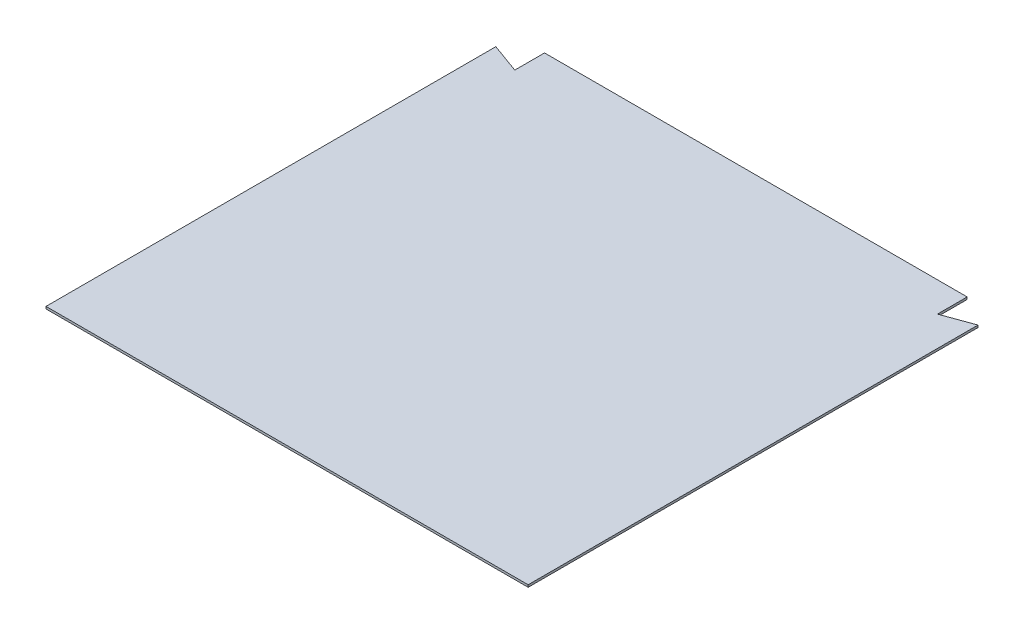
ISO-10303-21;
HEADER;
FILE_DESCRIPTION(('STEP AP214'),'2;1');
FILE_NAME('part.step','',(''),(''),'','','');
FILE_SCHEMA(('AUTOMOTIVE_DESIGN { 1 0 10303 214 1 1 1 1 }'));
ENDSEC;
DATA;
#1=APPLICATION_CONTEXT('core data for automotive mechanical design processes');
#2=APPLICATION_PROTOCOL_DEFINITION('international standard','automotive_design',2000,#1);
#3=PRODUCT_CONTEXT('',#1,'mechanical');
#4=PRODUCT('Part','Part','',(#3));
#5=PRODUCT_RELATED_PRODUCT_CATEGORY('part','',(#4));
#6=PRODUCT_DEFINITION_FORMATION('','',#4);
#7=PRODUCT_DEFINITION_CONTEXT('part definition',#1,'design');
#8=PRODUCT_DEFINITION('design','',#6,#7);
#9=PRODUCT_DEFINITION_SHAPE('','',#8);
#10=(LENGTH_UNIT() NAMED_UNIT(*) SI_UNIT(.MILLI.,.METRE.));
#11=(NAMED_UNIT(*) PLANE_ANGLE_UNIT() SI_UNIT($,.RADIAN.));
#12=(NAMED_UNIT(*) SI_UNIT($,.STERADIAN.) SOLID_ANGLE_UNIT());
#13=UNCERTAINTY_MEASURE_WITH_UNIT(LENGTH_MEASURE(1.E-05),#10,'distance_accuracy_value','');
#14=(GEOMETRIC_REPRESENTATION_CONTEXT(3) GLOBAL_UNCERTAINTY_ASSIGNED_CONTEXT((#13)) GLOBAL_UNIT_ASSIGNED_CONTEXT((#10,
#11,#12)) REPRESENTATION_CONTEXT('',''));
#15=CARTESIAN_POINT('',(0.,0.,0.));
#16=DIRECTION('',(0.,0.,1.));
#17=DIRECTION('',(1.,0.,0.));
#18=AXIS2_PLACEMENT_3D('',#15,#16,#17);
#19=CARTESIAN_POINT('',(-142.,1.5,147.5));
#20=DIRECTION('',(0.,0.,-1.));
#21=DIRECTION('',(-1.,0.,0.));
#22=AXIS2_PLACEMENT_3D('',#19,#20,#21);
#23=PLANE('',#22);
#24=DIRECTION('',(1.,0.,0.));
#25=VECTOR('',#24,1.);
#26=CARTESIAN_POINT('',(-142.,0.,147.5));
#27=LINE('',#26,#25);
#28=CARTESIAN_POINT('',(-162.,0.,147.5));
#29=VERTEX_POINT('',#28);
#30=CARTESIAN_POINT('',(162.,0.,147.5));
#31=VERTEX_POINT('',#30);
#32=EDGE_CURVE('E42',#29,#31,#27,.T.);
#33=ORIENTED_EDGE('',*,*,#32,.T.);
#34=DIRECTION('',(0.,-1.,0.));
#35=VECTOR('',#34,1.);
#36=CARTESIAN_POINT('',(162.,0.,147.5));
#37=LINE('',#36,#35);
#38=CARTESIAN_POINT('',(162.,1.49999999999996,147.5));
#39=VERTEX_POINT('',#38);
#40=EDGE_CURVE('E177',#39,#31,#37,.T.);
#41=ORIENTED_EDGE('',*,*,#40,.F.);
#42=DIRECTION('',(1.,0.,0.));
#43=VECTOR('',#42,1.);
#44=CARTESIAN_POINT('',(-142.,1.5,147.5));
#45=LINE('',#44,#43);
#46=CARTESIAN_POINT('',(-162.,1.5,147.5));
#47=VERTEX_POINT('',#46);
#48=EDGE_CURVE('E11',#47,#39,#45,.T.);
#49=ORIENTED_EDGE('',*,*,#48,.F.);
#50=DIRECTION('',(0.,1.,0.));
#51=VECTOR('',#50,1.);
#52=CARTESIAN_POINT('',(-162.,0.,147.5));
#53=LINE('',#52,#51);
#54=EDGE_CURVE('E108',#29,#47,#53,.T.);
#55=ORIENTED_EDGE('',*,*,#54,.F.);
#56=EDGE_LOOP('',(#33,#41,#49,#55));
#57=FACE_BOUND('',#56,.T.);
#58=ADVANCED_FACE('F39',(#57),#23,.F.);
#59=CARTESIAN_POINT('',(0.,1.5,0.));
#60=DIRECTION('',(0.,1.,0.));
#61=DIRECTION('',(0.,0.,1.));
#62=AXIS2_PLACEMENT_3D('',#59,#60,#61);
#63=PLANE('',#62);
#64=ORIENTED_EDGE('',*,*,#48,.T.);
#65=DIRECTION('',(0.,0.,1.));
#66=VECTOR('',#65,1.);
#67=CARTESIAN_POINT('',(162.,1.5,-147.5));
#68=LINE('',#67,#66);
#69=CARTESIAN_POINT('',(162.,1.5,-154.779404685324));
#70=VERTEX_POINT('',#69);
#71=EDGE_CURVE('E173',#70,#39,#68,.T.);
#72=ORIENTED_EDGE('',*,*,#71,.F.);
#73=DIRECTION('',(-0.939692620785908,0.,0.34202014332567));
#74=VECTOR('',#73,1.);
#75=CARTESIAN_POINT('',(142.,1.5,-147.5));
#76=LINE('',#75,#74);
#77=CARTESIAN_POINT('',(142.,1.5,-147.5));
#78=VERTEX_POINT('',#77);
#79=EDGE_CURVE('E137',#70,#78,#76,.T.);
#80=ORIENTED_EDGE('',*,*,#79,.T.);
#81=DIRECTION('',(0.,0.,-1.));
#82=VECTOR('',#81,1.);
#83=CARTESIAN_POINT('',(142.,1.5,-147.5));
#84=LINE('',#83,#82);
#85=CARTESIAN_POINT('',(142.,1.5,-167.5));
#86=VERTEX_POINT('',#85);
#87=EDGE_CURVE('E135',#78,#86,#84,.T.);
#88=ORIENTED_EDGE('',*,*,#87,.T.);
#89=DIRECTION('',(-1.,0.,0.));
#90=VECTOR('',#89,1.);
#91=CARTESIAN_POINT('',(142.,1.5,-167.5));
#92=LINE('',#91,#90);
#93=CARTESIAN_POINT('',(-142.,1.5,-167.5));
#94=VERTEX_POINT('',#93);
#95=EDGE_CURVE('E154',#86,#94,#92,.T.);
#96=ORIENTED_EDGE('',*,*,#95,.T.);
#97=DIRECTION('',(0.,0.,1.));
#98=VECTOR('',#97,1.);
#99=CARTESIAN_POINT('',(-142.,1.5,-147.5));
#100=LINE('',#99,#98);
#101=CARTESIAN_POINT('',(-142.,1.5,-147.5));
#102=VERTEX_POINT('',#101);
#103=EDGE_CURVE('E127',#94,#102,#100,.T.);
#104=ORIENTED_EDGE('',*,*,#103,.T.);
#105=DIRECTION('',(-0.93969262078591,0.,-0.342020143325663));
#106=VECTOR('',#105,1.);
#107=CARTESIAN_POINT('',(-162.,1.5,-154.779404685324));
#108=LINE('',#107,#106);
#109=CARTESIAN_POINT('',(-162.,1.5,-154.779404685324));
#110=VERTEX_POINT('',#109);
#111=EDGE_CURVE('E118',#102,#110,#108,.T.);
#112=ORIENTED_EDGE('',*,*,#111,.T.);
#113=DIRECTION('',(0.,0.,-1.));
#114=VECTOR('',#113,1.);
#115=CARTESIAN_POINT('',(-162.,1.5,147.5));
#116=LINE('',#115,#114);
#117=EDGE_CURVE('E103',#47,#110,#116,.T.);
#118=ORIENTED_EDGE('',*,*,#117,.F.);
#119=EDGE_LOOP('',(#64,#72,#80,#88,#96,#104,#112,#118));
#120=FACE_BOUND('',#119,.T.);
#121=ADVANCED_FACE('F124',(#120),#63,.T.);
#122=CARTESIAN_POINT('',(0.,0.,0.));
#123=DIRECTION('',(0.,1.,0.));
#124=DIRECTION('',(0.,0.,1.));
#125=AXIS2_PLACEMENT_3D('',#122,#123,#124);
#126=PLANE('',#125);
#127=ORIENTED_EDGE('',*,*,#32,.F.);
#128=DIRECTION('',(0.,0.,1.));
#129=VECTOR('',#128,1.);
#130=CARTESIAN_POINT('',(-162.,0.,147.5));
#131=LINE('',#130,#129);
#132=CARTESIAN_POINT('',(-162.,0.,-154.779404685324));
#133=VERTEX_POINT('',#132);
#134=EDGE_CURVE('E112',#133,#29,#131,.T.);
#135=ORIENTED_EDGE('',*,*,#134,.F.);
#136=DIRECTION('',(0.939692620785911,0.,0.342020143325663));
#137=VECTOR('',#136,1.);
#138=CARTESIAN_POINT('',(-162.,0.,-154.779404685324));
#139=LINE('',#138,#137);
#140=CARTESIAN_POINT('',(-142.,0.,-147.5));
#141=VERTEX_POINT('',#140);
#142=EDGE_CURVE('E120',#133,#141,#139,.T.);
#143=ORIENTED_EDGE('',*,*,#142,.T.);
#144=DIRECTION('',(0.,0.,-1.));
#145=VECTOR('',#144,1.);
#146=CARTESIAN_POINT('',(-142.,0.,-147.5));
#147=LINE('',#146,#145);
#148=CARTESIAN_POINT('',(-142.,0.,-167.5));
#149=VERTEX_POINT('',#148);
#150=EDGE_CURVE('E144',#141,#149,#147,.T.);
#151=ORIENTED_EDGE('',*,*,#150,.T.);
#152=DIRECTION('',(1.,0.,0.));
#153=VECTOR('',#152,1.);
#154=CARTESIAN_POINT('',(142.,0.,-167.5));
#155=LINE('',#154,#153);
#156=CARTESIAN_POINT('',(142.,0.,-167.5));
#157=VERTEX_POINT('',#156);
#158=EDGE_CURVE('E150',#149,#157,#155,.T.);
#159=ORIENTED_EDGE('',*,*,#158,.T.);
#160=DIRECTION('',(0.,0.,1.));
#161=VECTOR('',#160,1.);
#162=CARTESIAN_POINT('',(142.,0.,-147.5));
#163=LINE('',#162,#161);
#164=CARTESIAN_POINT('',(142.,0.,-147.5));
#165=VERTEX_POINT('',#164);
#166=EDGE_CURVE('E54',#157,#165,#163,.T.);
#167=ORIENTED_EDGE('',*,*,#166,.T.);
#168=DIRECTION('',(0.939692620785908,0.,-0.34202014332567));
#169=VECTOR('',#168,1.);
#170=CARTESIAN_POINT('',(142.,0.,-147.5));
#171=LINE('',#170,#169);
#172=CARTESIAN_POINT('',(162.,0.,-154.779404685324));
#173=VERTEX_POINT('',#172);
#174=EDGE_CURVE('E132',#165,#173,#171,.T.);
#175=ORIENTED_EDGE('',*,*,#174,.T.);
#176=DIRECTION('',(0.,0.,-1.));
#177=VECTOR('',#176,1.);
#178=CARTESIAN_POINT('',(162.,0.,-147.5));
#179=LINE('',#178,#177);
#180=EDGE_CURVE('E181',#31,#173,#179,.T.);
#181=ORIENTED_EDGE('',*,*,#180,.F.);
#182=EDGE_LOOP('',(#127,#135,#143,#151,#159,#167,#175,#181));
#183=FACE_BOUND('',#182,.T.);
#184=ADVANCED_FACE('F192',(#183),#126,.F.);
#185=CARTESIAN_POINT('',(-162.,0.,0.));
#186=DIRECTION('',(-1.,0.,0.));
#187=DIRECTION('',(0.,0.,1.));
#188=AXIS2_PLACEMENT_3D('',#185,#186,#187);
#189=PLANE('',#188);
#190=ORIENTED_EDGE('',*,*,#54,.T.);
#191=ORIENTED_EDGE('',*,*,#117,.T.);
#192=DIRECTION('',(0.,1.,0.));
#193=VECTOR('',#192,1.);
#194=CARTESIAN_POINT('',(-162.,-21.2835554495183,-154.779404685324));
#195=LINE('',#194,#193);
#196=EDGE_CURVE('E106',#133,#110,#195,.T.);
#197=ORIENTED_EDGE('',*,*,#196,.F.);
#198=ORIENTED_EDGE('',*,*,#134,.T.);
#199=EDGE_LOOP('',(#190,#191,#197,#198));
#200=FACE_BOUND('',#199,.T.);
#201=ADVANCED_FACE('F105',(#200),#189,.T.);
#202=CARTESIAN_POINT('',(162.,0.,0.));
#203=DIRECTION('',(1.,0.,0.));
#204=DIRECTION('',(0.,0.,-1.));
#205=AXIS2_PLACEMENT_3D('',#202,#203,#204);
#206=PLANE('',#205);
#207=ORIENTED_EDGE('',*,*,#180,.T.);
#208=DIRECTION('',(0.,1.,0.));
#209=VECTOR('',#208,1.);
#210=CARTESIAN_POINT('',(162.,-21.2835554495183,-154.779404685324));
#211=LINE('',#210,#209);
#212=EDGE_CURVE('E136',#173,#70,#211,.T.);
#213=ORIENTED_EDGE('',*,*,#212,.T.);
#214=ORIENTED_EDGE('',*,*,#71,.T.);
#215=ORIENTED_EDGE('',*,*,#40,.T.);
#216=EDGE_LOOP('',(#207,#213,#214,#215));
#217=FACE_BOUND('',#216,.T.);
#218=ADVANCED_FACE('F191',(#217),#206,.T.);
#219=CARTESIAN_POINT('',(142.,-284.703354388388,-147.5));
#220=DIRECTION('',(1.,0.,0.));
#221=DIRECTION('',(0.,0.,-1.));
#222=AXIS2_PLACEMENT_3D('',#219,#220,#221);
#223=PLANE('',#222);
#224=ORIENTED_EDGE('',*,*,#166,.F.);
#225=DIRECTION('',(0.,1.,0.));
#226=VECTOR('',#225,1.);
#227=CARTESIAN_POINT('',(142.,-284.703354388388,-167.5));
#228=LINE('',#227,#226);
#229=EDGE_CURVE('E159',#157,#86,#228,.T.);
#230=ORIENTED_EDGE('',*,*,#229,.T.);
#231=ORIENTED_EDGE('',*,*,#87,.F.);
#232=DIRECTION('',(0.,1.,0.));
#233=VECTOR('',#232,1.);
#234=CARTESIAN_POINT('',(142.,-284.703354388388,-147.5));
#235=LINE('',#234,#233);
#236=EDGE_CURVE('E147',#165,#78,#235,.T.);
#237=ORIENTED_EDGE('',*,*,#236,.F.);
#238=EDGE_LOOP('',(#224,#230,#231,#237));
#239=FACE_BOUND('',#238,.T.);
#240=ADVANCED_FACE('F200',(#239),#223,.T.);
#241=CARTESIAN_POINT('',(-142.,-284.703354388388,-147.5));
#242=DIRECTION('',(-1.,0.,0.));
#243=DIRECTION('',(0.,0.,1.));
#244=AXIS2_PLACEMENT_3D('',#241,#242,#243);
#245=PLANE('',#244);
#246=ORIENTED_EDGE('',*,*,#150,.F.);
#247=DIRECTION('',(0.,1.,0.));
#248=VECTOR('',#247,1.);
#249=CARTESIAN_POINT('',(-142.,-284.703354388388,-147.5));
#250=LINE('',#249,#248);
#251=EDGE_CURVE('E163',#141,#102,#250,.T.);
#252=ORIENTED_EDGE('',*,*,#251,.T.);
#253=ORIENTED_EDGE('',*,*,#103,.F.);
#254=DIRECTION('',(0.,1.,0.));
#255=VECTOR('',#254,1.);
#256=CARTESIAN_POINT('',(-142.,-284.703354388388,-167.5));
#257=LINE('',#256,#255);
#258=EDGE_CURVE('E166',#149,#94,#257,.T.);
#259=ORIENTED_EDGE('',*,*,#258,.F.);
#260=EDGE_LOOP('',(#246,#252,#253,#259));
#261=FACE_BOUND('',#260,.T.);
#262=ADVANCED_FACE('F208',(#261),#245,.T.);
#263=CARTESIAN_POINT('',(142.,-284.703354388388,-167.5));
#264=DIRECTION('',(0.,0.,-1.));
#265=DIRECTION('',(-1.,0.,0.));
#266=AXIS2_PLACEMENT_3D('',#263,#264,#265);
#267=PLANE('',#266);
#268=ORIENTED_EDGE('',*,*,#158,.F.);
#269=ORIENTED_EDGE('',*,*,#258,.T.);
#270=ORIENTED_EDGE('',*,*,#95,.F.);
#271=ORIENTED_EDGE('',*,*,#229,.F.);
#272=EDGE_LOOP('',(#268,#269,#270,#271));
#273=FACE_BOUND('',#272,.T.);
#274=ADVANCED_FACE('F204',(#273),#267,.T.);
#275=CARTESIAN_POINT('',(142.,-21.2835554495183,-147.5));
#276=DIRECTION('',(-0.34202014332567,0.,-0.939692620785908));
#277=DIRECTION('',(-0.939692620785908,0.,0.34202014332567));
#278=AXIS2_PLACEMENT_3D('',#275,#276,#277);
#279=PLANE('',#278);
#280=ORIENTED_EDGE('',*,*,#174,.F.);
#281=ORIENTED_EDGE('',*,*,#236,.T.);
#282=ORIENTED_EDGE('',*,*,#79,.F.);
#283=ORIENTED_EDGE('',*,*,#212,.F.);
#284=EDGE_LOOP('',(#280,#281,#282,#283));
#285=FACE_BOUND('',#284,.T.);
#286=ADVANCED_FACE('F197',(#285),#279,.T.);
#287=CARTESIAN_POINT('',(-162.,-21.2835554495183,-154.779404685324));
#288=DIRECTION('',(0.342020143325663,0.,-0.939692620785911));
#289=DIRECTION('',(-0.939692620785911,0.,-0.342020143325663));
#290=AXIS2_PLACEMENT_3D('',#287,#288,#289);
#291=PLANE('',#290);
#292=ORIENTED_EDGE('',*,*,#142,.F.);
#293=ORIENTED_EDGE('',*,*,#196,.T.);
#294=ORIENTED_EDGE('',*,*,#111,.F.);
#295=ORIENTED_EDGE('',*,*,#251,.F.);
#296=EDGE_LOOP('',(#292,#293,#294,#295));
#297=FACE_BOUND('',#296,.T.);
#298=ADVANCED_FACE('F116',(#297),#291,.T.);
#299=CLOSED_SHELL('',(#58,#121,#184,#201,#218,#240,#262,#274,#286,#298));
#300=MANIFOLD_SOLID_BREP('B2',#299);
#301=ADVANCED_BREP_SHAPE_REPRESENTATION('',(#18,#300),#14);
#302=SHAPE_DEFINITION_REPRESENTATION(#9,#301);
ENDSEC;
END-ISO-10303-21;
